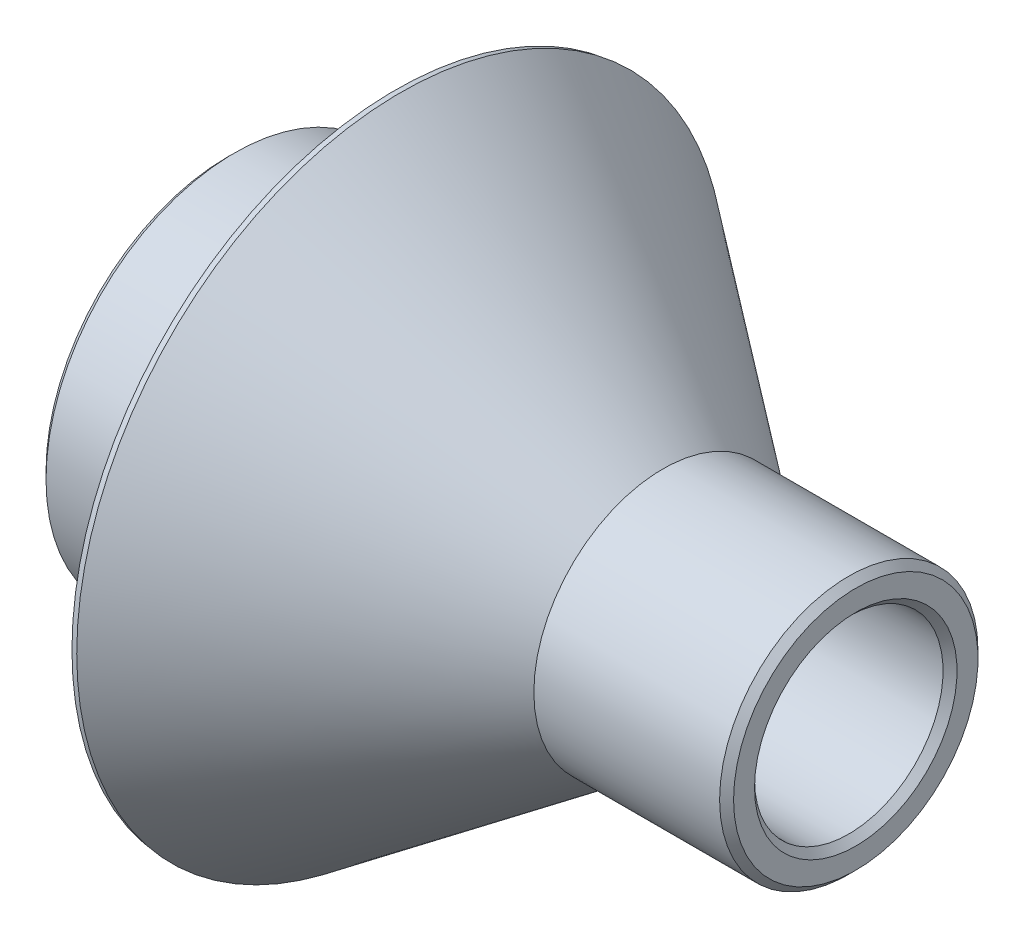
ISO-10303-21;
HEADER;
FILE_DESCRIPTION(('STEP AP214'),'2;1');
FILE_NAME('part.step','',(''),(''),'','','');
FILE_SCHEMA(('AUTOMOTIVE_DESIGN { 1 0 10303 214 1 1 1 1 }'));
ENDSEC;
DATA;
#1=APPLICATION_CONTEXT('core data for automotive mechanical design processes');
#2=APPLICATION_PROTOCOL_DEFINITION('international standard','automotive_design',2000,#1);
#3=PRODUCT_CONTEXT('',#1,'mechanical');
#4=PRODUCT('Part','Part','',(#3));
#5=PRODUCT_RELATED_PRODUCT_CATEGORY('part','',(#4));
#6=PRODUCT_DEFINITION_FORMATION('','',#4);
#7=PRODUCT_DEFINITION_CONTEXT('part definition',#1,'design');
#8=PRODUCT_DEFINITION('design','',#6,#7);
#9=PRODUCT_DEFINITION_SHAPE('','',#8);
#10=(LENGTH_UNIT() NAMED_UNIT(*) SI_UNIT(.MILLI.,.METRE.));
#11=(NAMED_UNIT(*) PLANE_ANGLE_UNIT() SI_UNIT($,.RADIAN.));
#12=(NAMED_UNIT(*) SI_UNIT($,.STERADIAN.) SOLID_ANGLE_UNIT());
#13=UNCERTAINTY_MEASURE_WITH_UNIT(LENGTH_MEASURE(1.E-05),#10,'distance_accuracy_value','');
#14=(GEOMETRIC_REPRESENTATION_CONTEXT(3) GLOBAL_UNCERTAINTY_ASSIGNED_CONTEXT((#13)) GLOBAL_UNIT_ASSIGNED_CONTEXT((#10,
#11,#12)) REPRESENTATION_CONTEXT('',''));
#15=CARTESIAN_POINT('',(0.,0.,0.));
#16=DIRECTION('',(0.,0.,1.));
#17=DIRECTION('',(1.,0.,0.));
#18=AXIS2_PLACEMENT_3D('',#15,#16,#17);
#19=CARTESIAN_POINT('',(6.096,0.,0.));
#20=DIRECTION('',(-1.,0.,0.));
#21=DIRECTION('',(0.,0.,1.));
#22=AXIS2_PLACEMENT_3D('',#19,#20,#21);
#23=CYLINDRICAL_SURFACE('',#22,6.858);
#24=CARTESIAN_POINT('',(0.253999999999994,0.,0.));
#25=DIRECTION('',(-1.,0.,0.));
#26=DIRECTION('',(0.,0.,1.));
#27=AXIS2_PLACEMENT_3D('',#24,#25,#26);
#28=CIRCLE('',#27,6.858);
#29=CARTESIAN_POINT('',(0.253999999999994,0.,6.858));
#30=VERTEX_POINT('',#29);
#31=EDGE_CURVE('E76',#30,#30,#28,.F.);
#32=ORIENTED_EDGE('',*,*,#31,.T.);
#33=EDGE_LOOP('',(#32));
#34=FACE_BOUND('',#33,.T.);
#35=CARTESIAN_POINT('',(6.096,0.,0.));
#36=DIRECTION('',(-1.,0.,0.));
#37=DIRECTION('',(0.,0.,1.));
#38=AXIS2_PLACEMENT_3D('',#35,#36,#37);
#39=CIRCLE('',#38,6.858);
#40=CARTESIAN_POINT('',(6.096,0.,6.858));
#41=VERTEX_POINT('',#40);
#42=EDGE_CURVE('E100',#41,#41,#39,.T.);
#43=ORIENTED_EDGE('',*,*,#42,.T.);
#44=EDGE_LOOP('',(#43));
#45=FACE_BOUND('',#44,.T.);
#46=ADVANCED_FACE('F47',(#34,#45),#23,.T.);
#47=CARTESIAN_POINT('',(0.,0.,0.));
#48=DIRECTION('',(-1.,0.,0.));
#49=DIRECTION('',(0.,0.,1.));
#50=AXIS2_PLACEMENT_3D('',#47,#48,#49);
#51=PLANE('',#50);
#52=CARTESIAN_POINT('',(0.,0.,0.));
#53=DIRECTION('',(-1.,0.,0.));
#54=DIRECTION('',(0.,0.,1.));
#55=AXIS2_PLACEMENT_3D('',#52,#53,#54);
#56=CIRCLE('',#55,3.683);
#57=CARTESIAN_POINT('',(0.,0.,3.683));
#58=VERTEX_POINT('',#57);
#59=EDGE_CURVE('E88',#58,#58,#56,.F.);
#60=ORIENTED_EDGE('',*,*,#59,.T.);
#61=EDGE_LOOP('',(#60));
#62=FACE_BOUND('',#61,.T.);
#63=CARTESIAN_POINT('',(0.,0.,0.));
#64=DIRECTION('',(-1.,0.,0.));
#65=DIRECTION('',(0.,0.,1.));
#66=AXIS2_PLACEMENT_3D('',#63,#64,#65);
#67=CIRCLE('',#66,6.60400000000001);
#68=CARTESIAN_POINT('',(0.,0.,6.60400000000001));
#69=VERTEX_POINT('',#68);
#70=EDGE_CURVE('E92',#69,#69,#67,.T.);
#71=ORIENTED_EDGE('',*,*,#70,.T.);
#72=EDGE_LOOP('',(#71));
#73=FACE_BOUND('',#72,.T.);
#74=ADVANCED_FACE('F123',(#62,#73),#51,.T.);
#75=CARTESIAN_POINT('',(22.8473,0.,0.));
#76=DIRECTION('',(-1.,0.,0.));
#77=DIRECTION('',(0.,0.,1.));
#78=AXIS2_PLACEMENT_3D('',#75,#76,#77);
#79=PLANE('',#78);
#80=CARTESIAN_POINT('',(22.8473,0.,0.));
#81=DIRECTION('',(-1.,0.,0.));
#82=DIRECTION('',(0.,0.,1.));
#83=AXIS2_PLACEMENT_3D('',#80,#81,#82);
#84=CIRCLE('',#83,3.68299999999999);
#85=CARTESIAN_POINT('',(22.8473,0.,3.68299999999999));
#86=VERTEX_POINT('',#85);
#87=EDGE_CURVE('E56',#86,#86,#84,.T.);
#88=ORIENTED_EDGE('',*,*,#87,.T.);
#89=EDGE_LOOP('',(#88));
#90=FACE_BOUND('',#89,.T.);
#91=CARTESIAN_POINT('',(22.8473,0.,0.));
#92=DIRECTION('',(-1.,0.,0.));
#93=DIRECTION('',(0.,0.,1.));
#94=AXIS2_PLACEMENT_3D('',#91,#92,#93);
#95=CIRCLE('',#94,4.445);
#96=CARTESIAN_POINT('',(22.8473,0.,4.445));
#97=VERTEX_POINT('',#96);
#98=EDGE_CURVE('E61',#97,#97,#95,.F.);
#99=ORIENTED_EDGE('',*,*,#98,.T.);
#100=EDGE_LOOP('',(#99));
#101=FACE_BOUND('',#100,.T.);
#102=ADVANCED_FACE('F129',(#90,#101),#79,.F.);
#103=CARTESIAN_POINT('',(6.096,0.,0.));
#104=DIRECTION('',(-1.,0.,0.));
#105=DIRECTION('',(0.,0.,1.));
#106=AXIS2_PLACEMENT_3D('',#103,#104,#105);
#107=CYLINDRICAL_SURFACE('',#106,4.699);
#108=CARTESIAN_POINT('',(22.5933,0.,0.));
#109=DIRECTION('',(-1.,0.,0.));
#110=DIRECTION('',(0.,0.,1.));
#111=AXIS2_PLACEMENT_3D('',#108,#109,#110);
#112=CIRCLE('',#111,4.699);
#113=CARTESIAN_POINT('',(22.5933,0.,4.699));
#114=VERTEX_POINT('',#113);
#115=EDGE_CURVE('E10',#114,#114,#112,.T.);
#116=ORIENTED_EDGE('',*,*,#115,.T.);
#117=EDGE_LOOP('',(#116));
#118=FACE_BOUND('',#117,.T.);
#119=CARTESIAN_POINT('',(15.8369,0.,0.));
#120=DIRECTION('',(-1.,0.,0.));
#121=DIRECTION('',(0.,0.,1.));
#122=AXIS2_PLACEMENT_3D('',#119,#120,#121);
#123=CIRCLE('',#122,4.699);
#124=CARTESIAN_POINT('',(15.8369,0.,4.699));
#125=VERTEX_POINT('',#124);
#126=EDGE_CURVE('E96',#125,#125,#123,.T.);
#127=ORIENTED_EDGE('',*,*,#126,.F.);
#128=EDGE_LOOP('',(#127));
#129=FACE_BOUND('',#128,.T.);
#130=ADVANCED_FACE('F119',(#118,#129),#107,.T.);
#131=CARTESIAN_POINT('',(15.8369,0.,0.));
#132=DIRECTION('',(-1.,0.,0.));
#133=DIRECTION('',(0.,0.,1.));
#134=AXIS2_PLACEMENT_3D('',#131,#132,#133);
#135=CONICAL_SURFACE('',#134,4.699,0.639105992681835);
#136=CARTESIAN_POINT('',(6.29986785093023,0.,0.));
#137=DIRECTION('',(-1.,0.,0.));
#138=DIRECTION('',(0.,0.,1.));
#139=AXIS2_PLACEMENT_3D('',#136,#137,#138);
#140=CIRCLE('',#139,11.7864945566751);
#141=CARTESIAN_POINT('',(6.29986785093023,0.,11.7864945566751));
#142=VERTEX_POINT('',#141);
#143=EDGE_CURVE('E66',#142,#142,#140,.F.);
#144=ORIENTED_EDGE('',*,*,#143,.T.);
#145=EDGE_LOOP('',(#144));
#146=FACE_BOUND('',#145,.T.);
#147=ORIENTED_EDGE('',*,*,#126,.T.);
#148=EDGE_LOOP('',(#147));
#149=FACE_BOUND('',#148,.T.);
#150=ADVANCED_FACE('F109',(#146,#149),#135,.T.);
#151=CARTESIAN_POINT('',(6.096,0.,0.));
#152=DIRECTION('',(-1.,0.,0.));
#153=DIRECTION('',(0.,0.,1.));
#154=AXIS2_PLACEMENT_3D('',#151,#152,#153);
#155=PLANE('',#154);
#156=CARTESIAN_POINT('',(6.096,0.,0.));
#157=DIRECTION('',(-1.,0.,0.));
#158=DIRECTION('',(0.,0.,1.));
#159=AXIS2_PLACEMENT_3D('',#156,#157,#158);
#160=CIRCLE('',#159,11.7564556885874);
#161=CARTESIAN_POINT('',(6.096,0.,11.7564556885874));
#162=VERTEX_POINT('',#161);
#163=EDGE_CURVE('E72',#162,#162,#160,.T.);
#164=ORIENTED_EDGE('',*,*,#163,.T.);
#165=EDGE_LOOP('',(#164));
#166=FACE_BOUND('',#165,.T.);
#167=ORIENTED_EDGE('',*,*,#42,.F.);
#168=EDGE_LOOP('',(#167));
#169=FACE_BOUND('',#168,.T.);
#170=ADVANCED_FACE('F106',(#166,#169),#155,.T.);
#171=CARTESIAN_POINT('',(0.,0.,0.));
#172=DIRECTION('',(1.,0.,0.));
#173=DIRECTION('',(0.,0.,-1.));
#174=AXIS2_PLACEMENT_3D('',#171,#172,#173);
#175=CYLINDRICAL_SURFACE('',#174,3.429);
#176=CARTESIAN_POINT('',(0.254000000000004,0.,0.));
#177=DIRECTION('',(-1.,0.,0.));
#178=DIRECTION('',(0.,0.,1.));
#179=AXIS2_PLACEMENT_3D('',#176,#177,#178);
#180=CIRCLE('',#179,3.429);
#181=CARTESIAN_POINT('',(0.254000000000004,0.,3.429));
#182=VERTEX_POINT('',#181);
#183=EDGE_CURVE('E80',#182,#182,#180,.T.);
#184=ORIENTED_EDGE('',*,*,#183,.T.);
#185=EDGE_LOOP('',(#184));
#186=FACE_BOUND('',#185,.T.);
#187=CARTESIAN_POINT('',(22.5933,0.,0.));
#188=DIRECTION('',(-1.,0.,0.));
#189=DIRECTION('',(0.,0.,1.));
#190=AXIS2_PLACEMENT_3D('',#187,#188,#189);
#191=CIRCLE('',#190,3.429);
#192=CARTESIAN_POINT('',(22.5933,0.,3.429));
#193=VERTEX_POINT('',#192);
#194=EDGE_CURVE('E84',#193,#193,#191,.F.);
#195=ORIENTED_EDGE('',*,*,#194,.T.);
#196=EDGE_LOOP('',(#195));
#197=FACE_BOUND('',#196,.T.);
#198=ADVANCED_FACE('F108',(#186,#197),#175,.F.);
#199=CARTESIAN_POINT('',(0.,0.,0.));
#200=DIRECTION('',(-1.,0.,0.));
#201=DIRECTION('',(0.,0.,1.));
#202=AXIS2_PLACEMENT_3D('',#199,#200,#201);
#203=CONICAL_SURFACE('',#202,3.683,0.785398163397445);
#204=ORIENTED_EDGE('',*,*,#183,.F.);
#205=EDGE_LOOP('',(#204));
#206=FACE_BOUND('',#205,.T.);
#207=ORIENTED_EDGE('',*,*,#59,.F.);
#208=EDGE_LOOP('',(#207));
#209=FACE_BOUND('',#208,.T.);
#210=ADVANCED_FACE('F116',(#206,#209),#203,.F.);
#211=CARTESIAN_POINT('',(0.,0.,0.));
#212=DIRECTION('',(1.,0.,0.));
#213=DIRECTION('',(0.,0.,-1.));
#214=AXIS2_PLACEMENT_3D('',#211,#212,#213);
#215=CONICAL_SURFACE('',#214,6.60400000000001,0.785398163397448);
#216=ORIENTED_EDGE('',*,*,#31,.F.);
#217=EDGE_LOOP('',(#216));
#218=FACE_BOUND('',#217,.T.);
#219=ORIENTED_EDGE('',*,*,#70,.F.);
#220=EDGE_LOOP('',(#219));
#221=FACE_BOUND('',#220,.T.);
#222=ADVANCED_FACE('F140',(#218,#221),#215,.T.);
#223=CARTESIAN_POINT('',(6.096,0.,0.));
#224=DIRECTION('',(1.,0.,0.));
#225=DIRECTION('',(0.,0.,-1.));
#226=AXIS2_PLACEMENT_3D('',#223,#224,#225);
#227=CONICAL_SURFACE('',#226,11.7564556885874,0.146292170715602);
#228=ORIENTED_EDGE('',*,*,#143,.F.);
#229=EDGE_LOOP('',(#228));
#230=FACE_BOUND('',#229,.T.);
#231=ORIENTED_EDGE('',*,*,#163,.F.);
#232=EDGE_LOOP('',(#231));
#233=FACE_BOUND('',#232,.T.);
#234=ADVANCED_FACE('F147',(#230,#233),#227,.T.);
#235=CARTESIAN_POINT('',(22.5933,0.,0.));
#236=DIRECTION('',(1.,0.,0.));
#237=DIRECTION('',(0.,0.,-1.));
#238=AXIS2_PLACEMENT_3D('',#235,#236,#237);
#239=CONICAL_SURFACE('',#238,3.429,0.785398163397431);
#240=ORIENTED_EDGE('',*,*,#87,.F.);
#241=EDGE_LOOP('',(#240));
#242=FACE_BOUND('',#241,.T.);
#243=ORIENTED_EDGE('',*,*,#194,.F.);
#244=EDGE_LOOP('',(#243));
#245=FACE_BOUND('',#244,.T.);
#246=ADVANCED_FACE('F153',(#242,#245),#239,.F.);
#247=CARTESIAN_POINT('',(22.5933,0.,0.));
#248=DIRECTION('',(-1.,0.,0.));
#249=DIRECTION('',(0.,0.,1.));
#250=AXIS2_PLACEMENT_3D('',#247,#248,#249);
#251=CONICAL_SURFACE('',#250,4.699,0.785398163397438);
#252=ORIENTED_EDGE('',*,*,#98,.F.);
#253=EDGE_LOOP('',(#252));
#254=FACE_BOUND('',#253,.T.);
#255=ORIENTED_EDGE('',*,*,#115,.F.);
#256=EDGE_LOOP('',(#255));
#257=FACE_BOUND('',#256,.T.);
#258=ADVANCED_FACE('F50',(#254,#257),#251,.T.);
#259=CLOSED_SHELL('',(#46,#74,#102,#130,#150,#170,#198,#210,#222,#234,#246,#258));
#260=MANIFOLD_SOLID_BREP('B2',#259);
#261=ADVANCED_BREP_SHAPE_REPRESENTATION('',(#18,#260),#14);
#262=SHAPE_DEFINITION_REPRESENTATION(#9,#261);
ENDSEC;
END-ISO-10303-21;
